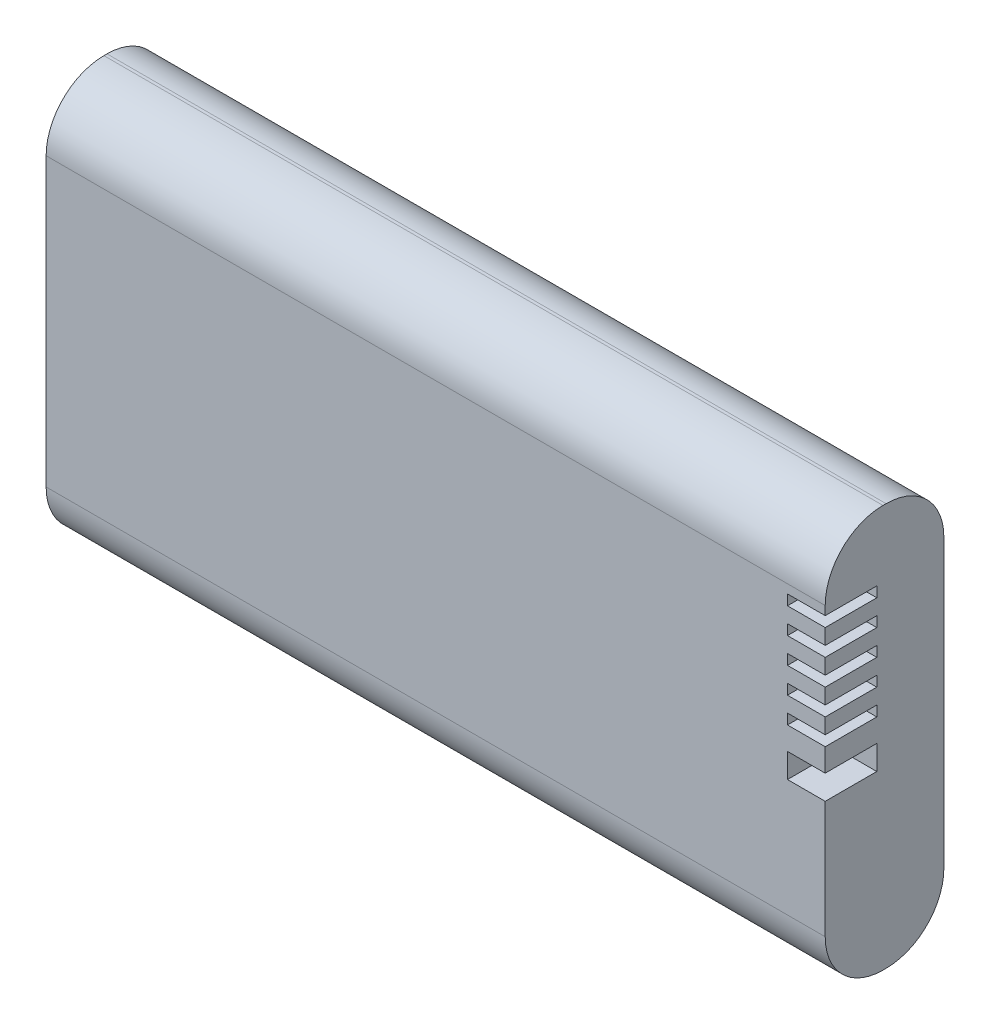
ISO-10303-21;
HEADER;
FILE_DESCRIPTION(('STEP AP214'),'2;1');
FILE_NAME('part.step','',(''),(''),'','','');
FILE_SCHEMA(('AUTOMOTIVE_DESIGN { 1 0 10303 214 1 1 1 1 }'));
ENDSEC;
DATA;
#1=APPLICATION_CONTEXT('core data for automotive mechanical design processes');
#2=APPLICATION_PROTOCOL_DEFINITION('international standard','automotive_design',2000,#1);
#3=PRODUCT_CONTEXT('',#1,'mechanical');
#4=PRODUCT('Part','Part','',(#3));
#5=PRODUCT_RELATED_PRODUCT_CATEGORY('part','',(#4));
#6=PRODUCT_DEFINITION_FORMATION('','',#4);
#7=PRODUCT_DEFINITION_CONTEXT('part definition',#1,'design');
#8=PRODUCT_DEFINITION('design','',#6,#7);
#9=PRODUCT_DEFINITION_SHAPE('','',#8);
#10=(LENGTH_UNIT() NAMED_UNIT(*) SI_UNIT(.MILLI.,.METRE.));
#11=(NAMED_UNIT(*) PLANE_ANGLE_UNIT() SI_UNIT($,.RADIAN.));
#12=(NAMED_UNIT(*) SI_UNIT($,.STERADIAN.) SOLID_ANGLE_UNIT());
#13=UNCERTAINTY_MEASURE_WITH_UNIT(LENGTH_MEASURE(1.E-05),#10,'distance_accuracy_value','');
#14=(GEOMETRIC_REPRESENTATION_CONTEXT(3) GLOBAL_UNCERTAINTY_ASSIGNED_CONTEXT((#13)) GLOBAL_UNIT_ASSIGNED_CONTEXT((#10,
#11,#12)) REPRESENTATION_CONTEXT('',''));
#15=CARTESIAN_POINT('',(0.,0.,0.));
#16=DIRECTION('',(0.,0.,1.));
#17=DIRECTION('',(1.,0.,0.));
#18=AXIS2_PLACEMENT_3D('',#15,#16,#17);
#19=CARTESIAN_POINT('',(-99.5908506352057,29.5307384157179,23.));
#20=DIRECTION('',(1.,0.,0.));
#21=DIRECTION('',(0.,0.,-1.));
#22=AXIS2_PLACEMENT_3D('',#19,#20,#21);
#23=PLANE('',#22);
#24=DIRECTION('',(0.,0.,-1.));
#25=VECTOR('',#24,1.);
#26=CARTESIAN_POINT('',(-99.5908506352057,-48.4692615842821,23.));
#27=LINE('',#26,#25);
#28=CARTESIAN_POINT('',(-99.5908506352057,-48.4692615842821,11.8));
#29=VERTEX_POINT('',#28);
#30=CARTESIAN_POINT('',(-99.5908506352057,-48.4692615842821,11.2));
#31=VERTEX_POINT('',#30);
#32=EDGE_CURVE('E508',#29,#31,#27,.T.);
#33=ORIENTED_EDGE('',*,*,#32,.F.);
#34=CARTESIAN_POINT('',(-99.5908506352057,-37.2692615842821,11.8));
#35=DIRECTION('',(1.,0.,0.));
#36=DIRECTION('',(0.,0.,-1.));
#37=AXIS2_PLACEMENT_3D('',#34,#35,#36);
#38=CIRCLE('',#37,11.2);
#39=CARTESIAN_POINT('',(-99.5908506352057,-37.2692615842821,23.));
#40=VERTEX_POINT('',#39);
#41=EDGE_CURVE('E546',#29,#40,#38,.F.);
#42=ORIENTED_EDGE('',*,*,#41,.T.);
#43=DIRECTION('',(0.,-1.,0.));
#44=VECTOR('',#43,1.);
#45=CARTESIAN_POINT('',(-99.5908506352057,29.5307384157179,23.));
#46=LINE('',#45,#44);
#47=CARTESIAN_POINT('',(-99.5908506352057,18.3307384157179,23.));
#48=VERTEX_POINT('',#47);
#49=EDGE_CURVE('E483',#48,#40,#46,.T.);
#50=ORIENTED_EDGE('',*,*,#49,.F.);
#51=CARTESIAN_POINT('',(-99.5908506352057,18.3307384157179,11.8));
#52=DIRECTION('',(1.,0.,0.));
#53=DIRECTION('',(0.,0.,-1.));
#54=AXIS2_PLACEMENT_3D('',#51,#52,#53);
#55=CIRCLE('',#54,11.2);
#56=CARTESIAN_POINT('',(-99.5908506352057,29.5307384157179,11.8));
#57=VERTEX_POINT('',#56);
#58=EDGE_CURVE('E63',#48,#57,#55,.F.);
#59=ORIENTED_EDGE('',*,*,#58,.T.);
#60=DIRECTION('',(0.,0.,-1.));
#61=VECTOR('',#60,1.);
#62=CARTESIAN_POINT('',(-99.5908506352057,29.5307384157179,23.));
#63=LINE('',#62,#61);
#64=CARTESIAN_POINT('',(-99.5908506352057,29.5307384157179,11.2));
#65=VERTEX_POINT('',#64);
#66=EDGE_CURVE('E491',#57,#65,#63,.T.);
#67=ORIENTED_EDGE('',*,*,#66,.T.);
#68=CARTESIAN_POINT('',(-99.5908506352057,18.3307384157179,11.2));
#69=DIRECTION('',(1.,0.,0.));
#70=DIRECTION('',(0.,0.,-1.));
#71=AXIS2_PLACEMENT_3D('',#68,#69,#70);
#72=CIRCLE('',#71,11.2);
#73=CARTESIAN_POINT('',(-99.5908506352057,18.3307384157179,0.));
#74=VERTEX_POINT('',#73);
#75=EDGE_CURVE('E55',#65,#74,#72,.F.);
#76=ORIENTED_EDGE('',*,*,#75,.T.);
#77=DIRECTION('',(0.,-1.,0.));
#78=VECTOR('',#77,1.);
#79=CARTESIAN_POINT('',(-99.5908506352057,29.5307384157179,0.));
#80=LINE('',#79,#78);
#81=CARTESIAN_POINT('',(-99.5908506352057,-37.2692615842821,0.));
#82=VERTEX_POINT('',#81);
#83=EDGE_CURVE('E473',#74,#82,#80,.T.);
#84=ORIENTED_EDGE('',*,*,#83,.T.);
#85=CARTESIAN_POINT('',(-99.5908506352057,-37.2692615842821,11.2));
#86=DIRECTION('',(1.,0.,0.));
#87=DIRECTION('',(0.,0.,-1.));
#88=AXIS2_PLACEMENT_3D('',#85,#86,#87);
#89=CIRCLE('',#88,11.2);
#90=EDGE_CURVE('E543',#82,#31,#89,.F.);
#91=ORIENTED_EDGE('',*,*,#90,.T.);
#92=EDGE_LOOP('',(#33,#42,#50,#59,#67,#76,#84,#91));
#93=FACE_BOUND('',#92,.T.);
#94=ADVANCED_FACE('F39',(#93),#23,.F.);
#95=CARTESIAN_POINT('',(-99.5908506352057,-48.4692615842821,23.));
#96=DIRECTION('',(0.,1.,0.));
#97=DIRECTION('',(0.,0.,1.));
#98=AXIS2_PLACEMENT_3D('',#95,#96,#97);
#99=PLANE('',#98);
#100=DIRECTION('',(0.,0.,-1.));
#101=VECTOR('',#100,1.);
#102=CARTESIAN_POINT('',(51.4091493647943,-48.4692615842821,23.));
#103=LINE('',#102,#101);
#104=CARTESIAN_POINT('',(51.4091493647943,-48.4692615842821,11.8));
#105=VERTEX_POINT('',#104);
#106=CARTESIAN_POINT('',(51.4091493647943,-48.4692615842821,11.2));
#107=VERTEX_POINT('',#106);
#108=EDGE_CURVE('E504',#105,#107,#103,.T.);
#109=ORIENTED_EDGE('',*,*,#108,.F.);
#110=DIRECTION('',(1.,0.,0.));
#111=VECTOR('',#110,1.);
#112=CARTESIAN_POINT('',(-99.5908506352057,-48.4692615842821,11.8));
#113=LINE('',#112,#111);
#114=EDGE_CURVE('E536',#105,#29,#113,.F.);
#115=ORIENTED_EDGE('',*,*,#114,.T.);
#116=ORIENTED_EDGE('',*,*,#32,.T.);
#117=DIRECTION('',(1.,0.,0.));
#118=VECTOR('',#117,1.);
#119=CARTESIAN_POINT('',(-99.5908506352057,-48.4692615842821,11.2));
#120=LINE('',#119,#118);
#121=EDGE_CURVE('E532',#31,#107,#120,.T.);
#122=ORIENTED_EDGE('',*,*,#121,.T.);
#123=EDGE_LOOP('',(#109,#115,#116,#122));
#124=FACE_BOUND('',#123,.T.);
#125=ADVANCED_FACE('F577',(#124),#99,.F.);
#126=CARTESIAN_POINT('',(51.4091493647943,29.5307384157179,23.));
#127=DIRECTION('',(-1.,0.,0.));
#128=DIRECTION('',(0.,-1.,0.));
#129=AXIS2_PLACEMENT_3D('',#126,#127,#128);
#130=PLANE('',#129);
#131=DIRECTION('',(0.,1.,0.));
#132=VECTOR('',#131,1.);
#133=CARTESIAN_POINT('',(51.4091493647943,29.5307384157179,23.));
#134=LINE('',#133,#132);
#135=CARTESIAN_POINT('',(51.4091493647943,-37.2692615842821,23.));
#136=VERTEX_POINT('',#135);
#137=CARTESIAN_POINT('',(51.4091493647943,-14.5292615842821,23.));
#138=VERTEX_POINT('',#137);
#139=EDGE_CURVE('E488',#136,#138,#134,.T.);
#140=ORIENTED_EDGE('',*,*,#139,.F.);
#141=CARTESIAN_POINT('',(51.4091493647943,-37.2692615842821,11.8));
#142=DIRECTION('',(-1.,0.,0.));
#143=DIRECTION('',(0.,-1.,0.));
#144=AXIS2_PLACEMENT_3D('',#141,#142,#143);
#145=CIRCLE('',#144,11.2);
#146=EDGE_CURVE('E529',#136,#105,#145,.F.);
#147=ORIENTED_EDGE('',*,*,#146,.T.);
#148=ORIENTED_EDGE('',*,*,#108,.T.);
#149=CARTESIAN_POINT('',(51.4091493647943,-37.2692615842821,11.2));
#150=DIRECTION('',(-1.,0.,0.));
#151=DIRECTION('',(0.,-1.,0.));
#152=AXIS2_PLACEMENT_3D('',#149,#150,#151);
#153=CIRCLE('',#152,11.2);
#154=CARTESIAN_POINT('',(51.4091493647943,-37.2692615842821,0.));
#155=VERTEX_POINT('',#154);
#156=EDGE_CURVE('E526',#107,#155,#153,.F.);
#157=ORIENTED_EDGE('',*,*,#156,.T.);
#158=DIRECTION('',(0.,1.,0.));
#159=VECTOR('',#158,1.);
#160=CARTESIAN_POINT('',(51.4091493647943,29.5307384157179,0.));
#161=LINE('',#160,#159);
#162=CARTESIAN_POINT('',(51.4091493647943,18.3307384157179,0.));
#163=VERTEX_POINT('',#162);
#164=EDGE_CURVE('E487',#155,#163,#161,.T.);
#165=ORIENTED_EDGE('',*,*,#164,.T.);
#166=CARTESIAN_POINT('',(51.4091493647943,18.3307384157179,11.2));
#167=DIRECTION('',(-1.,0.,0.));
#168=DIRECTION('',(0.,-1.,0.));
#169=AXIS2_PLACEMENT_3D('',#166,#167,#168);
#170=CIRCLE('',#169,11.2);
#171=CARTESIAN_POINT('',(51.4091493647943,29.5307384157179,11.2));
#172=VERTEX_POINT('',#171);
#173=EDGE_CURVE('E520',#163,#172,#170,.F.);
#174=ORIENTED_EDGE('',*,*,#173,.T.);
#175=DIRECTION('',(0.,0.,-1.));
#176=VECTOR('',#175,1.);
#177=CARTESIAN_POINT('',(51.4091493647943,29.5307384157179,23.));
#178=LINE('',#177,#176);
#179=CARTESIAN_POINT('',(51.4091493647943,29.5307384157179,11.8));
#180=VERTEX_POINT('',#179);
#181=EDGE_CURVE('E500',#180,#172,#178,.T.);
#182=ORIENTED_EDGE('',*,*,#181,.F.);
#183=CARTESIAN_POINT('',(51.4091493647943,18.3307384157179,11.8));
#184=DIRECTION('',(-1.,0.,0.));
#185=DIRECTION('',(0.,-1.,0.));
#186=AXIS2_PLACEMENT_3D('',#183,#184,#185);
#187=CIRCLE('',#186,11.2);
#188=CARTESIAN_POINT('',(51.4091493647943,18.3307384157179,23.));
#189=VERTEX_POINT('',#188);
#190=EDGE_CURVE('E523',#180,#189,#187,.F.);
#191=ORIENTED_EDGE('',*,*,#190,.T.);
#192=CARTESIAN_POINT('',(51.4091493647943,16.6307384157179,23.));
#193=VERTEX_POINT('',#192);
#194=EDGE_CURVE('E486',#193,#189,#134,.T.);
#195=ORIENTED_EDGE('',*,*,#194,.F.);
#196=DIRECTION('',(0.,0.,1.));
#197=VECTOR('',#196,1.);
#198=CARTESIAN_POINT('',(51.4091493647943,16.6307384157179,13.));
#199=LINE('',#198,#197);
#200=CARTESIAN_POINT('',(51.4091493647943,16.6307384157179,13.));
#201=VERTEX_POINT('',#200);
#202=EDGE_CURVE('E306',#201,#193,#199,.T.);
#203=ORIENTED_EDGE('',*,*,#202,.F.);
#204=DIRECTION('',(0.,1.,0.));
#205=VECTOR('',#204,1.);
#206=CARTESIAN_POINT('',(51.4091493647943,16.6307384157179,13.));
#207=LINE('',#206,#205);
#208=CARTESIAN_POINT('',(51.4091493647943,14.6307384157179,13.));
#209=VERTEX_POINT('',#208);
#210=EDGE_CURVE('E293',#209,#201,#207,.T.);
#211=ORIENTED_EDGE('',*,*,#210,.F.);
#212=DIRECTION('',(0.,0.,-1.));
#213=VECTOR('',#212,1.);
#214=CARTESIAN_POINT('',(51.4091493647943,14.6307384157179,13.));
#215=LINE('',#214,#213);
#216=CARTESIAN_POINT('',(51.4091493647943,14.6307384157179,23.));
#217=VERTEX_POINT('',#216);
#218=EDGE_CURVE('E309',#217,#209,#215,.T.);
#219=ORIENTED_EDGE('',*,*,#218,.F.);
#220=CARTESIAN_POINT('',(51.4091493647943,11.6307384157179,23.));
#221=VERTEX_POINT('',#220);
#222=EDGE_CURVE('E590',#221,#217,#134,.T.);
#223=ORIENTED_EDGE('',*,*,#222,.F.);
#224=DIRECTION('',(0.,0.,1.));
#225=VECTOR('',#224,1.);
#226=CARTESIAN_POINT('',(51.4091493647943,11.6307384157179,13.));
#227=LINE('',#226,#225);
#228=CARTESIAN_POINT('',(51.4091493647943,11.6307384157179,13.));
#229=VERTEX_POINT('',#228);
#230=EDGE_CURVE('E320',#229,#221,#227,.T.);
#231=ORIENTED_EDGE('',*,*,#230,.F.);
#232=DIRECTION('',(0.,1.,0.));
#233=VECTOR('',#232,1.);
#234=CARTESIAN_POINT('',(51.4091493647943,11.6307384157179,13.));
#235=LINE('',#234,#233);
#236=CARTESIAN_POINT('',(51.4091493647943,9.6307384157179,13.));
#237=VERTEX_POINT('',#236);
#238=EDGE_CURVE('E412',#237,#229,#235,.T.);
#239=ORIENTED_EDGE('',*,*,#238,.F.);
#240=DIRECTION('',(0.,0.,-1.));
#241=VECTOR('',#240,1.);
#242=CARTESIAN_POINT('',(51.4091493647943,9.6307384157179,13.));
#243=LINE('',#242,#241);
#244=CARTESIAN_POINT('',(51.4091493647943,9.6307384157179,23.));
#245=VERTEX_POINT('',#244);
#246=EDGE_CURVE('E427',#245,#237,#243,.T.);
#247=ORIENTED_EDGE('',*,*,#246,.F.);
#248=CARTESIAN_POINT('',(51.4091493647943,6.6307384157179,23.));
#249=VERTEX_POINT('',#248);
#250=EDGE_CURVE('E593',#249,#245,#134,.T.);
#251=ORIENTED_EDGE('',*,*,#250,.F.);
#252=DIRECTION('',(0.,0.,1.));
#253=VECTOR('',#252,1.);
#254=CARTESIAN_POINT('',(51.4091493647943,6.6307384157179,13.));
#255=LINE('',#254,#253);
#256=CARTESIAN_POINT('',(51.4091493647943,6.6307384157179,13.));
#257=VERTEX_POINT('',#256);
#258=EDGE_CURVE('E464',#257,#249,#255,.T.);
#259=ORIENTED_EDGE('',*,*,#258,.F.);
#260=DIRECTION('',(0.,1.,0.));
#261=VECTOR('',#260,1.);
#262=CARTESIAN_POINT('',(51.4091493647943,6.6307384157179,13.));
#263=LINE('',#262,#261);
#264=CARTESIAN_POINT('',(51.4091493647943,4.6307384157179,13.));
#265=VERTEX_POINT('',#264);
#266=EDGE_CURVE('E398',#265,#257,#263,.T.);
#267=ORIENTED_EDGE('',*,*,#266,.F.);
#268=DIRECTION('',(0.,0.,-1.));
#269=VECTOR('',#268,1.);
#270=CARTESIAN_POINT('',(51.4091493647943,4.6307384157179,13.));
#271=LINE('',#270,#269);
#272=CARTESIAN_POINT('',(51.4091493647943,4.6307384157179,23.));
#273=VERTEX_POINT('',#272);
#274=EDGE_CURVE('E450',#273,#265,#271,.T.);
#275=ORIENTED_EDGE('',*,*,#274,.F.);
#276=CARTESIAN_POINT('',(51.4091493647943,1.6307384157179,23.));
#277=VERTEX_POINT('',#276);
#278=EDGE_CURVE('E598',#277,#273,#134,.T.);
#279=ORIENTED_EDGE('',*,*,#278,.F.);
#280=DIRECTION('',(0.,0.,1.));
#281=VECTOR('',#280,1.);
#282=CARTESIAN_POINT('',(51.4091493647943,1.6307384157179,13.));
#283=LINE('',#282,#281);
#284=CARTESIAN_POINT('',(51.4091493647943,1.6307384157179,13.));
#285=VERTEX_POINT('',#284);
#286=EDGE_CURVE('E347',#285,#277,#283,.T.);
#287=ORIENTED_EDGE('',*,*,#286,.F.);
#288=DIRECTION('',(0.,1.,0.));
#289=VECTOR('',#288,1.);
#290=CARTESIAN_POINT('',(51.4091493647943,1.6307384157179,13.));
#291=LINE('',#290,#289);
#292=CARTESIAN_POINT('',(51.4091493647943,-0.3692615842821,13.));
#293=VERTEX_POINT('',#292);
#294=EDGE_CURVE('E334',#293,#285,#291,.T.);
#295=ORIENTED_EDGE('',*,*,#294,.F.);
#296=DIRECTION('',(0.,0.,-1.));
#297=VECTOR('',#296,1.);
#298=CARTESIAN_POINT('',(51.4091493647943,-0.3692615842821,13.));
#299=LINE('',#298,#297);
#300=CARTESIAN_POINT('',(51.4091493647943,-0.369261584282102,23.));
#301=VERTEX_POINT('',#300);
#302=EDGE_CURVE('E350',#301,#293,#299,.T.);
#303=ORIENTED_EDGE('',*,*,#302,.F.);
#304=CARTESIAN_POINT('',(51.4091493647943,-3.3692615842821,23.));
#305=VERTEX_POINT('',#304);
#306=EDGE_CURVE('E603',#305,#301,#134,.T.);
#307=ORIENTED_EDGE('',*,*,#306,.F.);
#308=DIRECTION('',(0.,0.,1.));
#309=VECTOR('',#308,1.);
#310=CARTESIAN_POINT('',(51.4091493647943,-3.3692615842821,13.));
#311=LINE('',#310,#309);
#312=CARTESIAN_POINT('',(51.4091493647943,-3.3692615842821,13.));
#313=VERTEX_POINT('',#312);
#314=EDGE_CURVE('E615',#313,#305,#311,.T.);
#315=ORIENTED_EDGE('',*,*,#314,.F.);
#316=DIRECTION('',(0.,1.,0.));
#317=VECTOR('',#316,1.);
#318=CARTESIAN_POINT('',(51.4091493647943,-3.3692615842821,13.));
#319=LINE('',#318,#317);
#320=CARTESIAN_POINT('',(51.4091493647943,-5.3692615842821,13.));
#321=VERTEX_POINT('',#320);
#322=EDGE_CURVE('E960',#321,#313,#319,.T.);
#323=ORIENTED_EDGE('',*,*,#322,.F.);
#324=DIRECTION('',(0.,0.,-1.));
#325=VECTOR('',#324,1.);
#326=CARTESIAN_POINT('',(51.4091493647943,-5.3692615842821,13.));
#327=LINE('',#326,#325);
#328=CARTESIAN_POINT('',(51.4091493647943,-5.3692615842821,23.));
#329=VERTEX_POINT('',#328);
#330=EDGE_CURVE('E957',#329,#321,#327,.T.);
#331=ORIENTED_EDGE('',*,*,#330,.F.);
#332=CARTESIAN_POINT('',(51.4091493647943,-9.8092615842821,23.));
#333=VERTEX_POINT('',#332);
#334=EDGE_CURVE('E278',#333,#329,#134,.T.);
#335=ORIENTED_EDGE('',*,*,#334,.F.);
#336=DIRECTION('',(0.,0.,1.));
#337=VECTOR('',#336,1.);
#338=CARTESIAN_POINT('',(51.4091493647943,-9.8092615842821,13.));
#339=LINE('',#338,#337);
#340=CARTESIAN_POINT('',(51.4091493647943,-9.8092615842821,13.));
#341=VERTEX_POINT('',#340);
#342=EDGE_CURVE('E388',#341,#333,#339,.T.);
#343=ORIENTED_EDGE('',*,*,#342,.F.);
#344=DIRECTION('',(0.,1.,0.));
#345=VECTOR('',#344,1.);
#346=CARTESIAN_POINT('',(51.4091493647943,-9.8092615842821,13.));
#347=LINE('',#346,#345);
#348=CARTESIAN_POINT('',(51.4091493647943,-14.5292615842821,13.));
#349=VERTEX_POINT('',#348);
#350=EDGE_CURVE('E384',#349,#341,#347,.T.);
#351=ORIENTED_EDGE('',*,*,#350,.F.);
#352=DIRECTION('',(0.,0.,-1.));
#353=VECTOR('',#352,1.);
#354=CARTESIAN_POINT('',(51.4091493647943,-14.5292615842821,13.));
#355=LINE('',#354,#353);
#356=EDGE_CURVE('E373',#138,#349,#355,.T.);
#357=ORIENTED_EDGE('',*,*,#356,.F.);
#358=EDGE_LOOP('',(#140,#147,#148,#157,#165,#174,#182,#191,#195,#203,#211,#219,#223,#231,#239,
#247,#251,#259,#267,#275,#279,#287,#295,#303,#307,#315,#323,#331,#335,#343,#351,#357));
#359=FACE_BOUND('',#358,.T.);
#360=ADVANCED_FACE('F569',(#359),#130,.F.);
#361=CARTESIAN_POINT('',(-99.5908506352057,29.5307384157179,23.));
#362=DIRECTION('',(0.,-1.,0.));
#363=DIRECTION('',(0.,0.,-1.));
#364=AXIS2_PLACEMENT_3D('',#361,#362,#363);
#365=PLANE('',#364);
#366=ORIENTED_EDGE('',*,*,#66,.F.);
#367=DIRECTION('',(-1.,0.,0.));
#368=VECTOR('',#367,1.);
#369=CARTESIAN_POINT('',(51.4091493647943,29.5307384157179,11.8));
#370=LINE('',#369,#368);
#371=EDGE_CURVE('E11',#57,#180,#370,.F.);
#372=ORIENTED_EDGE('',*,*,#371,.T.);
#373=ORIENTED_EDGE('',*,*,#181,.T.);
#374=DIRECTION('',(-1.,0.,0.));
#375=VECTOR('',#374,1.);
#376=CARTESIAN_POINT('',(-99.5908506352057,29.5307384157179,11.2));
#377=LINE('',#376,#375);
#378=EDGE_CURVE('E48',#172,#65,#377,.T.);
#379=ORIENTED_EDGE('',*,*,#378,.T.);
#380=EDGE_LOOP('',(#366,#372,#373,#379));
#381=FACE_BOUND('',#380,.T.);
#382=ADVANCED_FACE('F556',(#381),#365,.F.);
#383=CARTESIAN_POINT('',(0.,0.,23.));
#384=DIRECTION('',(0.,0.,1.));
#385=DIRECTION('',(1.,0.,0.));
#386=AXIS2_PLACEMENT_3D('',#383,#384,#385);
#387=PLANE('',#386);
#388=ORIENTED_EDGE('',*,*,#49,.T.);
#389=DIRECTION('',(1.,0.,0.));
#390=VECTOR('',#389,1.);
#391=CARTESIAN_POINT('',(51.4091493647943,-37.2692615842821,23.));
#392=LINE('',#391,#390);
#393=EDGE_CURVE('E516',#40,#136,#392,.T.);
#394=ORIENTED_EDGE('',*,*,#393,.T.);
#395=ORIENTED_EDGE('',*,*,#139,.T.);
#396=DIRECTION('',(1.,0.,0.));
#397=VECTOR('',#396,1.);
#398=CARTESIAN_POINT('',(44.0991493647943,-14.5292615842821,23.));
#399=LINE('',#398,#397);
#400=CARTESIAN_POINT('',(44.0991493647943,-14.5292615842821,23.));
#401=VERTEX_POINT('',#400);
#402=EDGE_CURVE('E399',#401,#138,#399,.T.);
#403=ORIENTED_EDGE('',*,*,#402,.F.);
#404=DIRECTION('',(0.,-1.,0.));
#405=VECTOR('',#404,1.);
#406=CARTESIAN_POINT('',(44.0991493647943,-9.8092615842821,23.));
#407=LINE('',#406,#405);
#408=CARTESIAN_POINT('',(44.0991493647943,-9.8092615842821,23.));
#409=VERTEX_POINT('',#408);
#410=EDGE_CURVE('E376',#409,#401,#407,.T.);
#411=ORIENTED_EDGE('',*,*,#410,.F.);
#412=DIRECTION('',(1.,0.,0.));
#413=VECTOR('',#412,1.);
#414=CARTESIAN_POINT('',(44.0991493647943,-9.8092615842821,23.));
#415=LINE('',#414,#413);
#416=EDGE_CURVE('E403',#409,#333,#415,.T.);
#417=ORIENTED_EDGE('',*,*,#416,.T.);
#418=ORIENTED_EDGE('',*,*,#334,.T.);
#419=DIRECTION('',(1.,0.,0.));
#420=VECTOR('',#419,1.);
#421=CARTESIAN_POINT('',(44.0991493647943,-5.3692615842821,23.));
#422=LINE('',#421,#420);
#423=CARTESIAN_POINT('',(44.0991493647943,-5.3692615842821,23.));
#424=VERTEX_POINT('',#423);
#425=EDGE_CURVE('E254',#424,#329,#422,.T.);
#426=ORIENTED_EDGE('',*,*,#425,.F.);
#427=DIRECTION('',(0.,-1.,0.));
#428=VECTOR('',#427,1.);
#429=CARTESIAN_POINT('',(44.0991493647943,-3.3692615842821,23.));
#430=LINE('',#429,#428);
#431=CARTESIAN_POINT('',(44.0991493647943,-3.36926158428209,23.));
#432=VERTEX_POINT('',#431);
#433=EDGE_CURVE('E262',#432,#424,#430,.T.);
#434=ORIENTED_EDGE('',*,*,#433,.F.);
#435=DIRECTION('',(1.,0.,0.));
#436=VECTOR('',#435,1.);
#437=CARTESIAN_POINT('',(44.0991493647943,-3.3692615842821,23.));
#438=LINE('',#437,#436);
#439=EDGE_CURVE('E280',#432,#305,#438,.T.);
#440=ORIENTED_EDGE('',*,*,#439,.T.);
#441=ORIENTED_EDGE('',*,*,#306,.T.);
#442=DIRECTION('',(1.,0.,0.));
#443=VECTOR('',#442,1.);
#444=CARTESIAN_POINT('',(44.0991493647943,-0.369261584282099,23.));
#445=LINE('',#444,#443);
#446=CARTESIAN_POINT('',(44.0991493647943,-0.369261584282099,23.));
#447=VERTEX_POINT('',#446);
#448=EDGE_CURVE('E362',#447,#301,#445,.T.);
#449=ORIENTED_EDGE('',*,*,#448,.F.);
#450=DIRECTION('',(0.,-1.,0.));
#451=VECTOR('',#450,1.);
#452=CARTESIAN_POINT('',(44.0991493647943,1.6307384157179,23.));
#453=LINE('',#452,#451);
#454=CARTESIAN_POINT('',(44.0991493647943,1.63073841571791,23.));
#455=VERTEX_POINT('',#454);
#456=EDGE_CURVE('E333',#455,#447,#453,.T.);
#457=ORIENTED_EDGE('',*,*,#456,.F.);
#458=DIRECTION('',(1.,0.,0.));
#459=VECTOR('',#458,1.);
#460=CARTESIAN_POINT('',(44.0991493647943,1.6307384157179,23.));
#461=LINE('',#460,#459);
#462=EDGE_CURVE('E346',#455,#277,#461,.T.);
#463=ORIENTED_EDGE('',*,*,#462,.T.);
#464=ORIENTED_EDGE('',*,*,#278,.T.);
#465=DIRECTION('',(1.,0.,0.));
#466=VECTOR('',#465,1.);
#467=CARTESIAN_POINT('',(44.0991493647943,4.6307384157179,23.));
#468=LINE('',#467,#466);
#469=CARTESIAN_POINT('',(44.0991493647943,4.6307384157179,23.));
#470=VERTEX_POINT('',#469);
#471=EDGE_CURVE('E474',#470,#273,#468,.T.);
#472=ORIENTED_EDGE('',*,*,#471,.F.);
#473=DIRECTION('',(0.,-1.,0.));
#474=VECTOR('',#473,1.);
#475=CARTESIAN_POINT('',(44.0991493647943,6.6307384157179,23.));
#476=LINE('',#475,#474);
#477=CARTESIAN_POINT('',(44.0991493647943,6.63073841571791,23.));
#478=VERTEX_POINT('',#477);
#479=EDGE_CURVE('E453',#478,#470,#476,.T.);
#480=ORIENTED_EDGE('',*,*,#479,.F.);
#481=DIRECTION('',(1.,0.,0.));
#482=VECTOR('',#481,1.);
#483=CARTESIAN_POINT('',(44.0991493647943,6.6307384157179,23.));
#484=LINE('',#483,#482);
#485=EDGE_CURVE('E477',#478,#249,#484,.T.);
#486=ORIENTED_EDGE('',*,*,#485,.T.);
#487=ORIENTED_EDGE('',*,*,#250,.T.);
#488=DIRECTION('',(1.,0.,0.));
#489=VECTOR('',#488,1.);
#490=CARTESIAN_POINT('',(44.0991493647943,9.6307384157179,23.));
#491=LINE('',#490,#489);
#492=CARTESIAN_POINT('',(44.0991493647943,9.6307384157179,23.));
#493=VERTEX_POINT('',#492);
#494=EDGE_CURVE('E439',#493,#245,#491,.T.);
#495=ORIENTED_EDGE('',*,*,#494,.F.);
#496=DIRECTION('',(0.,-1.,0.));
#497=VECTOR('',#496,1.);
#498=CARTESIAN_POINT('',(44.0991493647943,11.6307384157179,23.));
#499=LINE('',#498,#497);
#500=CARTESIAN_POINT('',(44.0991493647943,11.6307384157179,23.));
#501=VERTEX_POINT('',#500);
#502=EDGE_CURVE('E411',#501,#493,#499,.T.);
#503=ORIENTED_EDGE('',*,*,#502,.F.);
#504=DIRECTION('',(1.,0.,0.));
#505=VECTOR('',#504,1.);
#506=CARTESIAN_POINT('',(44.0991493647943,11.6307384157179,23.));
#507=LINE('',#506,#505);
#508=EDGE_CURVE('E424',#501,#221,#507,.T.);
#509=ORIENTED_EDGE('',*,*,#508,.T.);
#510=ORIENTED_EDGE('',*,*,#222,.T.);
#511=DIRECTION('',(1.,0.,0.));
#512=VECTOR('',#511,1.);
#513=CARTESIAN_POINT('',(44.0991493647943,14.6307384157179,23.));
#514=LINE('',#513,#512);
#515=CARTESIAN_POINT('',(44.0991493647943,14.6307384157179,23.));
#516=VERTEX_POINT('',#515);
#517=EDGE_CURVE('E324',#516,#217,#514,.T.);
#518=ORIENTED_EDGE('',*,*,#517,.F.);
#519=DIRECTION('',(0.,-1.,0.));
#520=VECTOR('',#519,1.);
#521=CARTESIAN_POINT('',(44.0991493647943,16.6307384157179,23.));
#522=LINE('',#521,#520);
#523=CARTESIAN_POINT('',(44.0991493647943,16.6307384157179,23.));
#524=VERTEX_POINT('',#523);
#525=EDGE_CURVE('E292',#524,#516,#522,.T.);
#526=ORIENTED_EDGE('',*,*,#525,.F.);
#527=DIRECTION('',(1.,0.,0.));
#528=VECTOR('',#527,1.);
#529=CARTESIAN_POINT('',(44.0991493647943,16.6307384157179,23.));
#530=LINE('',#529,#528);
#531=EDGE_CURVE('E305',#524,#193,#530,.T.);
#532=ORIENTED_EDGE('',*,*,#531,.T.);
#533=ORIENTED_EDGE('',*,*,#194,.T.);
#534=DIRECTION('',(-1.,0.,0.));
#535=VECTOR('',#534,1.);
#536=CARTESIAN_POINT('',(-99.5908506352057,18.3307384157179,23.));
#537=LINE('',#536,#535);
#538=EDGE_CURVE('E512',#189,#48,#537,.T.);
#539=ORIENTED_EDGE('',*,*,#538,.T.);
#540=EDGE_LOOP('',(#388,#394,#395,#403,#411,#417,#418,#426,#434,#440,#441,#449,#457,#463,#464,
#472,#480,#486,#487,#495,#503,#509,#510,#518,#526,#532,#533,#539));
#541=FACE_BOUND('',#540,.T.);
#542=ADVANCED_FACE('F275',(#541),#387,.T.);
#543=CARTESIAN_POINT('',(0.,0.,0.));
#544=DIRECTION('',(0.,0.,1.));
#545=DIRECTION('',(1.,0.,0.));
#546=AXIS2_PLACEMENT_3D('',#543,#544,#545);
#547=PLANE('',#546);
#548=ORIENTED_EDGE('',*,*,#164,.F.);
#549=DIRECTION('',(1.,0.,0.));
#550=VECTOR('',#549,1.);
#551=CARTESIAN_POINT('',(0.,-37.2692615842821,0.));
#552=LINE('',#551,#550);
#553=EDGE_CURVE('E552',#155,#82,#552,.F.);
#554=ORIENTED_EDGE('',*,*,#553,.T.);
#555=ORIENTED_EDGE('',*,*,#83,.F.);
#556=DIRECTION('',(-1.,0.,0.));
#557=VECTOR('',#556,1.);
#558=CARTESIAN_POINT('',(0.,18.3307384157179,0.));
#559=LINE('',#558,#557);
#560=EDGE_CURVE('E549',#74,#163,#559,.F.);
#561=ORIENTED_EDGE('',*,*,#560,.T.);
#562=EDGE_LOOP('',(#548,#554,#555,#561));
#563=FACE_BOUND('',#562,.T.);
#564=ADVANCED_FACE('F565',(#563),#547,.F.);
#565=CARTESIAN_POINT('',(44.0991493647943,6.63073841571791,13.));
#566=DIRECTION('',(0.,0.,-1.));
#567=DIRECTION('',(-1.,0.,0.));
#568=AXIS2_PLACEMENT_3D('',#565,#566,#567);
#569=PLANE('',#568);
#570=ORIENTED_EDGE('',*,*,#266,.T.);
#571=DIRECTION('',(1.,0.,0.));
#572=VECTOR('',#571,1.);
#573=CARTESIAN_POINT('',(44.0991493647943,6.63073841571791,13.));
#574=LINE('',#573,#572);
#575=CARTESIAN_POINT('',(44.0991493647943,6.63073841571791,13.));
#576=VERTEX_POINT('',#575);
#577=EDGE_CURVE('E460',#576,#257,#574,.T.);
#578=ORIENTED_EDGE('',*,*,#577,.F.);
#579=DIRECTION('',(0.,1.,0.));
#580=VECTOR('',#579,1.);
#581=CARTESIAN_POINT('',(44.0991493647943,6.63073841571791,13.));
#582=LINE('',#581,#580);
#583=CARTESIAN_POINT('',(44.0991493647943,4.6307384157179,13.));
#584=VERTEX_POINT('',#583);
#585=EDGE_CURVE('E445',#584,#576,#582,.T.);
#586=ORIENTED_EDGE('',*,*,#585,.F.);
#587=DIRECTION('',(1.,0.,0.));
#588=VECTOR('',#587,1.);
#589=CARTESIAN_POINT('',(44.0991493647943,4.6307384157179,13.));
#590=LINE('',#589,#588);
#591=EDGE_CURVE('E470',#584,#265,#590,.T.);
#592=ORIENTED_EDGE('',*,*,#591,.T.);
#593=EDGE_LOOP('',(#570,#578,#586,#592));
#594=FACE_BOUND('',#593,.T.);
#595=ADVANCED_FACE('F719',(#594),#569,.F.);
#596=CARTESIAN_POINT('',(44.0991493647943,4.6307384157179,13.));
#597=DIRECTION('',(0.,-1.,0.));
#598=DIRECTION('',(1.,0.,0.));
#599=AXIS2_PLACEMENT_3D('',#596,#597,#598);
#600=PLANE('',#599);
#601=ORIENTED_EDGE('',*,*,#274,.T.);
#602=ORIENTED_EDGE('',*,*,#591,.F.);
#603=DIRECTION('',(0.,0.,-1.));
#604=VECTOR('',#603,1.);
#605=CARTESIAN_POINT('',(44.0991493647943,4.6307384157179,13.));
#606=LINE('',#605,#604);
#607=EDGE_CURVE('E456',#470,#584,#606,.T.);
#608=ORIENTED_EDGE('',*,*,#607,.F.);
#609=ORIENTED_EDGE('',*,*,#471,.T.);
#610=EDGE_LOOP('',(#601,#602,#608,#609));
#611=FACE_BOUND('',#610,.T.);
#612=ADVANCED_FACE('F630',(#611),#600,.F.);
#613=CARTESIAN_POINT('',(44.0991493647943,6.63073841571791,13.));
#614=DIRECTION('',(0.,1.,0.));
#615=DIRECTION('',(0.,0.,1.));
#616=AXIS2_PLACEMENT_3D('',#613,#614,#615);
#617=PLANE('',#616);
#618=ORIENTED_EDGE('',*,*,#258,.T.);
#619=ORIENTED_EDGE('',*,*,#485,.F.);
#620=DIRECTION('',(0.,0.,1.));
#621=VECTOR('',#620,1.);
#622=CARTESIAN_POINT('',(44.0991493647943,6.63073841571791,13.));
#623=LINE('',#622,#621);
#624=EDGE_CURVE('E449',#576,#478,#623,.T.);
#625=ORIENTED_EDGE('',*,*,#624,.F.);
#626=ORIENTED_EDGE('',*,*,#577,.T.);
#627=EDGE_LOOP('',(#618,#619,#625,#626));
#628=FACE_BOUND('',#627,.T.);
#629=ADVANCED_FACE('F639',(#628),#617,.F.);
#630=CARTESIAN_POINT('',(44.0991493647943,0.,0.));
#631=DIRECTION('',(-1.,0.,0.));
#632=DIRECTION('',(0.,0.,1.));
#633=AXIS2_PLACEMENT_3D('',#630,#631,#632);
#634=PLANE('',#633);
#635=ORIENTED_EDGE('',*,*,#585,.T.);
#636=ORIENTED_EDGE('',*,*,#624,.T.);
#637=ORIENTED_EDGE('',*,*,#479,.T.);
#638=ORIENTED_EDGE('',*,*,#607,.T.);
#639=EDGE_LOOP('',(#635,#636,#637,#638));
#640=FACE_BOUND('',#639,.T.);
#641=ADVANCED_FACE('F636',(#640),#634,.F.);
#642=CARTESIAN_POINT('',(44.0991493647943,-3.36926158428209,13.));
#643=DIRECTION('',(0.,1.,0.));
#644=DIRECTION('',(0.,0.,1.));
#645=AXIS2_PLACEMENT_3D('',#642,#643,#644);
#646=PLANE('',#645);
#647=ORIENTED_EDGE('',*,*,#314,.T.);
#648=ORIENTED_EDGE('',*,*,#439,.F.);
#649=DIRECTION('',(0.,0.,1.));
#650=VECTOR('',#649,1.);
#651=CARTESIAN_POINT('',(44.0991493647943,-3.36926158428209,13.));
#652=LINE('',#651,#650);
#653=CARTESIAN_POINT('',(44.0991493647943,-3.36926158428209,13.));
#654=VERTEX_POINT('',#653);
#655=EDGE_CURVE('E267',#654,#432,#652,.T.);
#656=ORIENTED_EDGE('',*,*,#655,.F.);
#657=DIRECTION('',(1.,0.,0.));
#658=VECTOR('',#657,1.);
#659=CARTESIAN_POINT('',(44.0991493647943,-3.36926158428209,13.));
#660=LINE('',#659,#658);
#661=EDGE_CURVE('E284',#654,#313,#660,.T.);
#662=ORIENTED_EDGE('',*,*,#661,.T.);
#663=EDGE_LOOP('',(#647,#648,#656,#662));
#664=FACE_BOUND('',#663,.T.);
#665=ADVANCED_FACE('F910',(#664),#646,.F.);
#666=CARTESIAN_POINT('',(44.0991493647943,-3.36926158428209,13.));
#667=DIRECTION('',(0.,0.,-1.));
#668=DIRECTION('',(-1.,0.,0.));
#669=AXIS2_PLACEMENT_3D('',#666,#667,#668);
#670=PLANE('',#669);
#671=ORIENTED_EDGE('',*,*,#322,.T.);
#672=ORIENTED_EDGE('',*,*,#661,.F.);
#673=DIRECTION('',(0.,1.,0.));
#674=VECTOR('',#673,1.);
#675=CARTESIAN_POINT('',(44.0991493647943,-3.36926158428209,13.));
#676=LINE('',#675,#674);
#677=CARTESIAN_POINT('',(44.0991493647943,-5.3692615842821,13.));
#678=VERTEX_POINT('',#677);
#679=EDGE_CURVE('E261',#678,#654,#676,.T.);
#680=ORIENTED_EDGE('',*,*,#679,.F.);
#681=DIRECTION('',(1.,0.,0.));
#682=VECTOR('',#681,1.);
#683=CARTESIAN_POINT('',(44.0991493647943,-5.3692615842821,13.));
#684=LINE('',#683,#682);
#685=EDGE_CURVE('E256',#678,#321,#684,.T.);
#686=ORIENTED_EDGE('',*,*,#685,.T.);
#687=EDGE_LOOP('',(#671,#672,#680,#686));
#688=FACE_BOUND('',#687,.T.);
#689=ADVANCED_FACE('F901',(#688),#670,.F.);
#690=CARTESIAN_POINT('',(44.0991493647943,-5.3692615842821,13.));
#691=DIRECTION('',(0.,-1.,0.));
#692=DIRECTION('',(1.,0.,0.));
#693=AXIS2_PLACEMENT_3D('',#690,#691,#692);
#694=PLANE('',#693);
#695=ORIENTED_EDGE('',*,*,#330,.T.);
#696=ORIENTED_EDGE('',*,*,#685,.F.);
#697=DIRECTION('',(0.,0.,-1.));
#698=VECTOR('',#697,1.);
#699=CARTESIAN_POINT('',(44.0991493647943,-5.3692615842821,13.));
#700=LINE('',#699,#698);
#701=EDGE_CURVE('E249',#424,#678,#700,.T.);
#702=ORIENTED_EDGE('',*,*,#701,.F.);
#703=ORIENTED_EDGE('',*,*,#425,.T.);
#704=EDGE_LOOP('',(#695,#696,#702,#703));
#705=FACE_BOUND('',#704,.T.);
#706=ADVANCED_FACE('F252',(#705),#694,.F.);
#707=CARTESIAN_POINT('',(44.0991493647943,0.,0.));
#708=DIRECTION('',(1.,0.,0.));
#709=DIRECTION('',(0.,0.,-1.));
#710=AXIS2_PLACEMENT_3D('',#707,#708,#709);
#711=PLANE('',#710);
#712=ORIENTED_EDGE('',*,*,#655,.T.);
#713=ORIENTED_EDGE('',*,*,#433,.T.);
#714=ORIENTED_EDGE('',*,*,#701,.T.);
#715=ORIENTED_EDGE('',*,*,#679,.T.);
#716=EDGE_LOOP('',(#712,#713,#714,#715));
#717=FACE_BOUND('',#716,.T.);
#718=ADVANCED_FACE('F265',(#717),#711,.T.);
#719=CARTESIAN_POINT('',(44.0991493647943,-9.8092615842821,13.));
#720=DIRECTION('',(0.,0.,-1.));
#721=DIRECTION('',(0.,1.,0.));
#722=AXIS2_PLACEMENT_3D('',#719,#720,#721);
#723=PLANE('',#722);
#724=ORIENTED_EDGE('',*,*,#350,.T.);
#725=DIRECTION('',(1.,0.,0.));
#726=VECTOR('',#725,1.);
#727=CARTESIAN_POINT('',(44.0991493647943,-9.8092615842821,13.));
#728=LINE('',#727,#726);
#729=CARTESIAN_POINT('',(44.0991493647943,-9.8092615842821,13.));
#730=VERTEX_POINT('',#729);
#731=EDGE_CURVE('E383',#730,#341,#728,.T.);
#732=ORIENTED_EDGE('',*,*,#731,.F.);
#733=DIRECTION('',(0.,1.,0.));
#734=VECTOR('',#733,1.);
#735=CARTESIAN_POINT('',(44.0991493647943,-9.8092615842821,13.));
#736=LINE('',#735,#734);
#737=CARTESIAN_POINT('',(44.0991493647943,-14.5292615842821,13.));
#738=VERTEX_POINT('',#737);
#739=EDGE_CURVE('E368',#738,#730,#736,.T.);
#740=ORIENTED_EDGE('',*,*,#739,.F.);
#741=DIRECTION('',(1.,0.,0.));
#742=VECTOR('',#741,1.);
#743=CARTESIAN_POINT('',(44.0991493647943,-14.5292615842821,13.));
#744=LINE('',#743,#742);
#745=EDGE_CURVE('E395',#738,#349,#744,.T.);
#746=ORIENTED_EDGE('',*,*,#745,.T.);
#747=EDGE_LOOP('',(#724,#732,#740,#746));
#748=FACE_BOUND('',#747,.T.);
#749=ADVANCED_FACE('F874',(#748),#723,.F.);
#750=CARTESIAN_POINT('',(44.0991493647943,-14.5292615842821,13.));
#751=DIRECTION('',(0.,-1.,0.));
#752=DIRECTION('',(0.,0.,-1.));
#753=AXIS2_PLACEMENT_3D('',#750,#751,#752);
#754=PLANE('',#753);
#755=ORIENTED_EDGE('',*,*,#356,.T.);
#756=ORIENTED_EDGE('',*,*,#745,.F.);
#757=DIRECTION('',(0.,0.,-1.));
#758=VECTOR('',#757,1.);
#759=CARTESIAN_POINT('',(44.0991493647943,-14.5292615842821,13.));
#760=LINE('',#759,#758);
#761=EDGE_CURVE('E379',#401,#738,#760,.T.);
#762=ORIENTED_EDGE('',*,*,#761,.F.);
#763=ORIENTED_EDGE('',*,*,#402,.T.);
#764=EDGE_LOOP('',(#755,#756,#762,#763));
#765=FACE_BOUND('',#764,.T.);
#766=ADVANCED_FACE('F864',(#765),#754,.F.);
#767=CARTESIAN_POINT('',(44.0991493647943,-9.8092615842821,13.));
#768=DIRECTION('',(0.,1.,0.));
#769=DIRECTION('',(-1.,0.,0.));
#770=AXIS2_PLACEMENT_3D('',#767,#768,#769);
#771=PLANE('',#770);
#772=ORIENTED_EDGE('',*,*,#342,.T.);
#773=ORIENTED_EDGE('',*,*,#416,.F.);
#774=DIRECTION('',(0.,0.,1.));
#775=VECTOR('',#774,1.);
#776=CARTESIAN_POINT('',(44.0991493647943,-9.8092615842821,13.));
#777=LINE('',#776,#775);
#778=EDGE_CURVE('E372',#730,#409,#777,.T.);
#779=ORIENTED_EDGE('',*,*,#778,.F.);
#780=ORIENTED_EDGE('',*,*,#731,.T.);
#781=EDGE_LOOP('',(#772,#773,#779,#780));
#782=FACE_BOUND('',#781,.T.);
#783=ADVANCED_FACE('F854',(#782),#771,.F.);
#784=CARTESIAN_POINT('',(44.0991493647943,0.,0.));
#785=DIRECTION('',(-1.,0.,0.));
#786=DIRECTION('',(0.,0.,1.));
#787=AXIS2_PLACEMENT_3D('',#784,#785,#786);
#788=PLANE('',#787);
#789=ORIENTED_EDGE('',*,*,#739,.T.);
#790=ORIENTED_EDGE('',*,*,#778,.T.);
#791=ORIENTED_EDGE('',*,*,#410,.T.);
#792=ORIENTED_EDGE('',*,*,#761,.T.);
#793=EDGE_LOOP('',(#789,#790,#791,#792));
#794=FACE_BOUND('',#793,.T.);
#795=ADVANCED_FACE('F845',(#794),#788,.F.);
#796=CARTESIAN_POINT('',(44.0991493647943,11.6307384157179,13.));
#797=DIRECTION('',(0.,1.,0.));
#798=DIRECTION('',(-1.,0.,0.));
#799=AXIS2_PLACEMENT_3D('',#796,#797,#798);
#800=PLANE('',#799);
#801=ORIENTED_EDGE('',*,*,#230,.T.);
#802=ORIENTED_EDGE('',*,*,#508,.F.);
#803=DIRECTION('',(0.,0.,1.));
#804=VECTOR('',#803,1.);
#805=CARTESIAN_POINT('',(44.0991493647943,11.6307384157179,13.));
#806=LINE('',#805,#804);
#807=CARTESIAN_POINT('',(44.0991493647943,11.6307384157179,13.));
#808=VERTEX_POINT('',#807);
#809=EDGE_CURVE('E408',#808,#501,#806,.T.);
#810=ORIENTED_EDGE('',*,*,#809,.F.);
#811=DIRECTION('',(1.,0.,0.));
#812=VECTOR('',#811,1.);
#813=CARTESIAN_POINT('',(44.0991493647943,11.6307384157179,13.));
#814=LINE('',#813,#812);
#815=EDGE_CURVE('E389',#808,#229,#814,.T.);
#816=ORIENTED_EDGE('',*,*,#815,.T.);
#817=EDGE_LOOP('',(#801,#802,#810,#816));
#818=FACE_BOUND('',#817,.T.);
#819=ADVANCED_FACE('F652',(#818),#800,.F.);
#820=CARTESIAN_POINT('',(44.0991493647943,11.6307384157179,13.));
#821=DIRECTION('',(0.,0.,-1.));
#822=DIRECTION('',(-1.,0.,0.));
#823=AXIS2_PLACEMENT_3D('',#820,#821,#822);
#824=PLANE('',#823);
#825=ORIENTED_EDGE('',*,*,#238,.T.);
#826=ORIENTED_EDGE('',*,*,#815,.F.);
#827=DIRECTION('',(0.,1.,0.));
#828=VECTOR('',#827,1.);
#829=CARTESIAN_POINT('',(44.0991493647943,11.6307384157179,13.));
#830=LINE('',#829,#828);
#831=CARTESIAN_POINT('',(44.0991493647943,9.6307384157179,13.));
#832=VERTEX_POINT('',#831);
#833=EDGE_CURVE('E420',#832,#808,#830,.T.);
#834=ORIENTED_EDGE('',*,*,#833,.F.);
#835=DIRECTION('',(1.,0.,0.));
#836=VECTOR('',#835,1.);
#837=CARTESIAN_POINT('',(44.0991493647943,9.6307384157179,13.));
#838=LINE('',#837,#836);
#839=EDGE_CURVE('E436',#832,#237,#838,.T.);
#840=ORIENTED_EDGE('',*,*,#839,.T.);
#841=EDGE_LOOP('',(#825,#826,#834,#840));
#842=FACE_BOUND('',#841,.T.);
#843=ADVANCED_FACE('F827',(#842),#824,.F.);
#844=CARTESIAN_POINT('',(44.0991493647943,9.6307384157179,13.));
#845=DIRECTION('',(0.,-1.,0.));
#846=DIRECTION('',(1.,0.,0.));
#847=AXIS2_PLACEMENT_3D('',#844,#845,#846);
#848=PLANE('',#847);
#849=ORIENTED_EDGE('',*,*,#246,.T.);
#850=ORIENTED_EDGE('',*,*,#839,.F.);
#851=DIRECTION('',(0.,0.,-1.));
#852=VECTOR('',#851,1.);
#853=CARTESIAN_POINT('',(44.0991493647943,9.6307384157179,13.));
#854=LINE('',#853,#852);
#855=EDGE_CURVE('E416',#493,#832,#854,.T.);
#856=ORIENTED_EDGE('',*,*,#855,.F.);
#857=ORIENTED_EDGE('',*,*,#494,.T.);
#858=EDGE_LOOP('',(#849,#850,#856,#857));
#859=FACE_BOUND('',#858,.T.);
#860=ADVANCED_FACE('F644',(#859),#848,.F.);
#861=CARTESIAN_POINT('',(44.0991493647943,-1.75760120954031E-13,0.));
#862=DIRECTION('',(1.,0.,0.));
#863=DIRECTION('',(0.,1.,0.));
#864=AXIS2_PLACEMENT_3D('',#861,#862,#863);
#865=PLANE('',#864);
#866=ORIENTED_EDGE('',*,*,#809,.T.);
#867=ORIENTED_EDGE('',*,*,#502,.T.);
#868=ORIENTED_EDGE('',*,*,#855,.T.);
#869=ORIENTED_EDGE('',*,*,#833,.T.);
#870=EDGE_LOOP('',(#866,#867,#868,#869));
#871=FACE_BOUND('',#870,.T.);
#872=ADVANCED_FACE('F648',(#871),#865,.T.);
#873=CARTESIAN_POINT('',(44.0991493647943,16.6307384157179,13.));
#874=DIRECTION('',(0.,1.,0.));
#875=DIRECTION('',(-1.,0.,0.));
#876=AXIS2_PLACEMENT_3D('',#873,#874,#875);
#877=PLANE('',#876);
#878=ORIENTED_EDGE('',*,*,#202,.T.);
#879=ORIENTED_EDGE('',*,*,#531,.F.);
#880=DIRECTION('',(0.,0.,1.));
#881=VECTOR('',#880,1.);
#882=CARTESIAN_POINT('',(44.0991493647943,16.6307384157179,13.));
#883=LINE('',#882,#881);
#884=CARTESIAN_POINT('',(44.0991493647943,16.6307384157179,13.));
#885=VERTEX_POINT('',#884);
#886=EDGE_CURVE('E289',#885,#524,#883,.T.);
#887=ORIENTED_EDGE('',*,*,#886,.F.);
#888=DIRECTION('',(1.,0.,0.));
#889=VECTOR('',#888,1.);
#890=CARTESIAN_POINT('',(44.0991493647943,16.6307384157179,13.));
#891=LINE('',#890,#889);
#892=EDGE_CURVE('E317',#885,#201,#891,.T.);
#893=ORIENTED_EDGE('',*,*,#892,.T.);
#894=EDGE_LOOP('',(#878,#879,#887,#893));
#895=FACE_BOUND('',#894,.T.);
#896=ADVANCED_FACE('F663',(#895),#877,.F.);
#897=CARTESIAN_POINT('',(44.0991493647943,16.6307384157179,13.));
#898=DIRECTION('',(0.,0.,-1.));
#899=DIRECTION('',(-1.,0.,0.));
#900=AXIS2_PLACEMENT_3D('',#897,#898,#899);
#901=PLANE('',#900);
#902=ORIENTED_EDGE('',*,*,#210,.T.);
#903=ORIENTED_EDGE('',*,*,#892,.F.);
#904=DIRECTION('',(0.,1.,0.));
#905=VECTOR('',#904,1.);
#906=CARTESIAN_POINT('',(44.0991493647943,16.6307384157179,13.));
#907=LINE('',#906,#905);
#908=CARTESIAN_POINT('',(44.0991493647943,14.6307384157179,13.));
#909=VERTEX_POINT('',#908);
#910=EDGE_CURVE('E301',#909,#885,#907,.T.);
#911=ORIENTED_EDGE('',*,*,#910,.F.);
#912=DIRECTION('',(1.,0.,0.));
#913=VECTOR('',#912,1.);
#914=CARTESIAN_POINT('',(44.0991493647943,14.6307384157179,13.));
#915=LINE('',#914,#913);
#916=EDGE_CURVE('E321',#909,#209,#915,.T.);
#917=ORIENTED_EDGE('',*,*,#916,.T.);
#918=EDGE_LOOP('',(#902,#903,#911,#917));
#919=FACE_BOUND('',#918,.T.);
#920=ADVANCED_FACE('F665',(#919),#901,.F.);
#921=CARTESIAN_POINT('',(44.0991493647943,14.6307384157179,13.));
#922=DIRECTION('',(0.,-1.,0.));
#923=DIRECTION('',(1.,0.,0.));
#924=AXIS2_PLACEMENT_3D('',#921,#922,#923);
#925=PLANE('',#924);
#926=ORIENTED_EDGE('',*,*,#218,.T.);
#927=ORIENTED_EDGE('',*,*,#916,.F.);
#928=DIRECTION('',(0.,0.,-1.));
#929=VECTOR('',#928,1.);
#930=CARTESIAN_POINT('',(44.0991493647943,14.6307384157179,13.));
#931=LINE('',#930,#929);
#932=EDGE_CURVE('E297',#516,#909,#931,.T.);
#933=ORIENTED_EDGE('',*,*,#932,.F.);
#934=ORIENTED_EDGE('',*,*,#517,.T.);
#935=EDGE_LOOP('',(#926,#927,#933,#934));
#936=FACE_BOUND('',#935,.T.);
#937=ADVANCED_FACE('F655',(#936),#925,.F.);
#938=CARTESIAN_POINT('',(44.0991493647943,0.,0.));
#939=DIRECTION('',(1.,0.,0.));
#940=DIRECTION('',(0.,0.,-1.));
#941=AXIS2_PLACEMENT_3D('',#938,#939,#940);
#942=PLANE('',#941);
#943=ORIENTED_EDGE('',*,*,#886,.T.);
#944=ORIENTED_EDGE('',*,*,#525,.T.);
#945=ORIENTED_EDGE('',*,*,#932,.T.);
#946=ORIENTED_EDGE('',*,*,#910,.T.);
#947=EDGE_LOOP('',(#943,#944,#945,#946));
#948=FACE_BOUND('',#947,.T.);
#949=ADVANCED_FACE('F659',(#948),#942,.T.);
#950=CARTESIAN_POINT('',(44.0991493647943,1.63073841571791,13.));
#951=DIRECTION('',(0.,1.,0.));
#952=DIRECTION('',(0.,0.,1.));
#953=AXIS2_PLACEMENT_3D('',#950,#951,#952);
#954=PLANE('',#953);
#955=ORIENTED_EDGE('',*,*,#286,.T.);
#956=ORIENTED_EDGE('',*,*,#462,.F.);
#957=DIRECTION('',(0.,0.,1.));
#958=VECTOR('',#957,1.);
#959=CARTESIAN_POINT('',(44.0991493647943,1.63073841571791,13.));
#960=LINE('',#959,#958);
#961=CARTESIAN_POINT('',(44.0991493647943,1.63073841571791,13.));
#962=VERTEX_POINT('',#961);
#963=EDGE_CURVE('E330',#962,#455,#960,.T.);
#964=ORIENTED_EDGE('',*,*,#963,.F.);
#965=DIRECTION('',(1.,0.,0.));
#966=VECTOR('',#965,1.);
#967=CARTESIAN_POINT('',(44.0991493647943,1.63073841571791,13.));
#968=LINE('',#967,#966);
#969=EDGE_CURVE('E310',#962,#285,#968,.T.);
#970=ORIENTED_EDGE('',*,*,#969,.T.);
#971=EDGE_LOOP('',(#955,#956,#964,#970));
#972=FACE_BOUND('',#971,.T.);
#973=ADVANCED_FACE('F778',(#972),#954,.F.);
#974=CARTESIAN_POINT('',(44.0991493647943,1.63073841571791,13.));
#975=DIRECTION('',(0.,0.,-1.));
#976=DIRECTION('',(-1.,0.,0.));
#977=AXIS2_PLACEMENT_3D('',#974,#975,#976);
#978=PLANE('',#977);
#979=ORIENTED_EDGE('',*,*,#294,.T.);
#980=ORIENTED_EDGE('',*,*,#969,.F.);
#981=DIRECTION('',(0.,1.,0.));
#982=VECTOR('',#981,1.);
#983=CARTESIAN_POINT('',(44.0991493647943,1.63073841571791,13.));
#984=LINE('',#983,#982);
#985=CARTESIAN_POINT('',(44.0991493647943,-0.369261584282098,13.));
#986=VERTEX_POINT('',#985);
#987=EDGE_CURVE('E342',#986,#962,#984,.T.);
#988=ORIENTED_EDGE('',*,*,#987,.F.);
#989=DIRECTION('',(1.,0.,0.));
#990=VECTOR('',#989,1.);
#991=CARTESIAN_POINT('',(44.0991493647943,-0.369261584282098,13.));
#992=LINE('',#991,#990);
#993=EDGE_CURVE('E359',#986,#293,#992,.T.);
#994=ORIENTED_EDGE('',*,*,#993,.T.);
#995=EDGE_LOOP('',(#979,#980,#988,#994));
#996=FACE_BOUND('',#995,.T.);
#997=ADVANCED_FACE('F769',(#996),#978,.F.);
#998=CARTESIAN_POINT('',(44.0991493647943,-0.369261584282098,13.));
#999=DIRECTION('',(0.,-1.,0.));
#1000=DIRECTION('',(1.,0.,0.));
#1001=AXIS2_PLACEMENT_3D('',#998,#999,#1000);
#1002=PLANE('',#1001);
#1003=ORIENTED_EDGE('',*,*,#302,.T.);
#1004=ORIENTED_EDGE('',*,*,#993,.F.);
#1005=DIRECTION('',(0.,0.,-1.));
#1006=VECTOR('',#1005,1.);
#1007=CARTESIAN_POINT('',(44.0991493647943,-0.369261584282098,13.));
#1008=LINE('',#1007,#1006);
#1009=EDGE_CURVE('E338',#447,#986,#1008,.T.);
#1010=ORIENTED_EDGE('',*,*,#1009,.F.);
#1011=ORIENTED_EDGE('',*,*,#448,.T.);
#1012=EDGE_LOOP('',(#1003,#1004,#1010,#1011));
#1013=FACE_BOUND('',#1012,.T.);
#1014=ADVANCED_FACE('F619',(#1013),#1002,.F.);
#1015=CARTESIAN_POINT('',(44.0991493647943,0.,0.));
#1016=DIRECTION('',(1.,0.,0.));
#1017=DIRECTION('',(0.,0.,-1.));
#1018=AXIS2_PLACEMENT_3D('',#1015,#1016,#1017);
#1019=PLANE('',#1018);
#1020=ORIENTED_EDGE('',*,*,#963,.T.);
#1021=ORIENTED_EDGE('',*,*,#456,.T.);
#1022=ORIENTED_EDGE('',*,*,#1009,.T.);
#1023=ORIENTED_EDGE('',*,*,#987,.T.);
#1024=EDGE_LOOP('',(#1020,#1021,#1022,#1023));
#1025=FACE_BOUND('',#1024,.T.);
#1026=ADVANCED_FACE('F622',(#1025),#1019,.T.);
#1027=CARTESIAN_POINT('',(0.,-37.2692615842821,11.8));
#1028=DIRECTION('',(-1.,0.,0.));
#1029=DIRECTION('',(0.,0.,1.));
#1030=AXIS2_PLACEMENT_3D('',#1027,#1028,#1029);
#1031=CYLINDRICAL_SURFACE('',#1030,11.2);
#1032=ORIENTED_EDGE('',*,*,#41,.F.);
#1033=ORIENTED_EDGE('',*,*,#114,.F.);
#1034=ORIENTED_EDGE('',*,*,#146,.F.);
#1035=ORIENTED_EDGE('',*,*,#393,.F.);
#1036=EDGE_LOOP('',(#1032,#1033,#1034,#1035));
#1037=FACE_BOUND('',#1036,.T.);
#1038=ADVANCED_FACE('F580',(#1037),#1031,.T.);
#1039=CARTESIAN_POINT('',(-99.5908506352057,-37.2692615842821,11.2));
#1040=DIRECTION('',(1.,0.,0.));
#1041=DIRECTION('',(0.,0.,-1.));
#1042=AXIS2_PLACEMENT_3D('',#1039,#1040,#1041);
#1043=CYLINDRICAL_SURFACE('',#1042,11.2);
#1044=ORIENTED_EDGE('',*,*,#90,.F.);
#1045=ORIENTED_EDGE('',*,*,#553,.F.);
#1046=ORIENTED_EDGE('',*,*,#156,.F.);
#1047=ORIENTED_EDGE('',*,*,#121,.F.);
#1048=EDGE_LOOP('',(#1044,#1045,#1046,#1047));
#1049=FACE_BOUND('',#1048,.T.);
#1050=ADVANCED_FACE('F572',(#1049),#1043,.T.);
#1051=CARTESIAN_POINT('',(0.,18.3307384157179,11.8));
#1052=DIRECTION('',(1.,0.,0.));
#1053=DIRECTION('',(0.,0.,-1.));
#1054=AXIS2_PLACEMENT_3D('',#1051,#1052,#1053);
#1055=CYLINDRICAL_SURFACE('',#1054,11.2);
#1056=ORIENTED_EDGE('',*,*,#190,.F.);
#1057=ORIENTED_EDGE('',*,*,#371,.F.);
#1058=ORIENTED_EDGE('',*,*,#58,.F.);
#1059=ORIENTED_EDGE('',*,*,#538,.F.);
#1060=EDGE_LOOP('',(#1056,#1057,#1058,#1059));
#1061=FACE_BOUND('',#1060,.T.);
#1062=ADVANCED_FACE('F586',(#1061),#1055,.T.);
#1063=CARTESIAN_POINT('',(-99.5908506352057,18.3307384157179,11.2));
#1064=DIRECTION('',(-1.,0.,0.));
#1065=DIRECTION('',(0.,0.,1.));
#1066=AXIS2_PLACEMENT_3D('',#1063,#1064,#1065);
#1067=CYLINDRICAL_SURFACE('',#1066,11.2);
#1068=ORIENTED_EDGE('',*,*,#173,.F.);
#1069=ORIENTED_EDGE('',*,*,#560,.F.);
#1070=ORIENTED_EDGE('',*,*,#75,.F.);
#1071=ORIENTED_EDGE('',*,*,#378,.F.);
#1072=EDGE_LOOP('',(#1068,#1069,#1070,#1071));
#1073=FACE_BOUND('',#1072,.T.);
#1074=ADVANCED_FACE('F41',(#1073),#1067,.T.);
#1075=CLOSED_SHELL('',(#94,#125,#360,#382,#542,#564,#595,#612,#629,#641,#665,#689,#706,#718,
#749,#766,#783,#795,#819,#843,#860,#872,#896,#920,#937,#949,#973,#997,#1014,#1026,#1038,#1050,
#1062,#1074));
#1076=MANIFOLD_SOLID_BREP('B2',#1075);
#1077=ADVANCED_BREP_SHAPE_REPRESENTATION('',(#18,#1076),#14);
#1078=SHAPE_DEFINITION_REPRESENTATION(#9,#1077);
ENDSEC;
END-ISO-10303-21;
